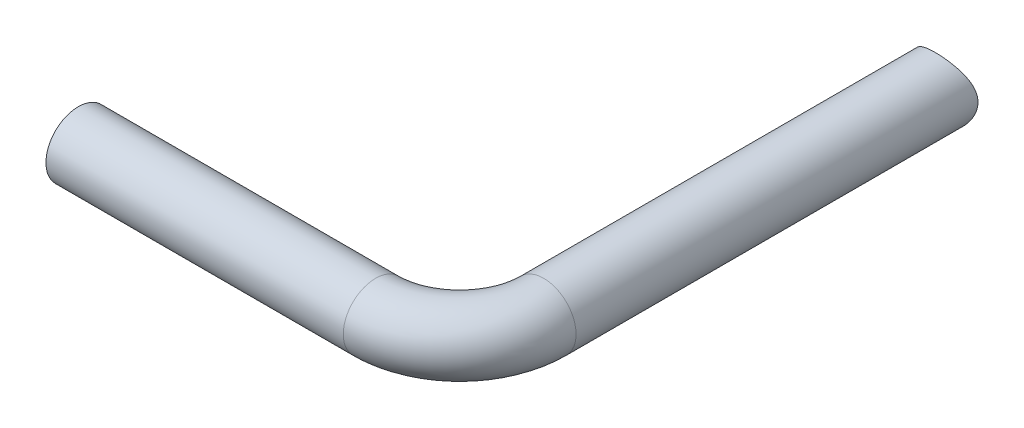
ISO-10303-21;
HEADER;
FILE_DESCRIPTION(('STEP AP214'),'2;1');
FILE_NAME('part.step','',(''),(''),'','','');
FILE_SCHEMA(('AUTOMOTIVE_DESIGN { 1 0 10303 214 1 1 1 1 }'));
ENDSEC;
DATA;
#1=APPLICATION_CONTEXT('core data for automotive mechanical design processes');
#2=APPLICATION_PROTOCOL_DEFINITION('international standard','automotive_design',2000,#1);
#3=PRODUCT_CONTEXT('',#1,'mechanical');
#4=PRODUCT('Part','Part','',(#3));
#5=PRODUCT_RELATED_PRODUCT_CATEGORY('part','',(#4));
#6=PRODUCT_DEFINITION_FORMATION('','',#4);
#7=PRODUCT_DEFINITION_CONTEXT('part definition',#1,'design');
#8=PRODUCT_DEFINITION('design','',#6,#7);
#9=PRODUCT_DEFINITION_SHAPE('','',#8);
#10=(LENGTH_UNIT() NAMED_UNIT(*) SI_UNIT(.MILLI.,.METRE.));
#11=(NAMED_UNIT(*) PLANE_ANGLE_UNIT() SI_UNIT($,.RADIAN.));
#12=(NAMED_UNIT(*) SI_UNIT($,.STERADIAN.) SOLID_ANGLE_UNIT());
#13=UNCERTAINTY_MEASURE_WITH_UNIT(LENGTH_MEASURE(1.E-05),#10,'distance_accuracy_value','');
#14=(GEOMETRIC_REPRESENTATION_CONTEXT(3) GLOBAL_UNCERTAINTY_ASSIGNED_CONTEXT((#13)) GLOBAL_UNIT_ASSIGNED_CONTEXT((#10,
#11,#12)) REPRESENTATION_CONTEXT('',''));
#15=CARTESIAN_POINT('',(0.,0.,0.));
#16=DIRECTION('',(0.,0.,1.));
#17=DIRECTION('',(1.,0.,0.));
#18=AXIS2_PLACEMENT_3D('',#15,#16,#17);
#19=CARTESIAN_POINT('',(22.14,-0.535,-3.8));
#20=DIRECTION('',(-1.,0.,0.));
#21=DIRECTION('',(0.,0.,1.));
#22=AXIS2_PLACEMENT_3D('',#19,#20,#21);
#23=PLANE('',#22);
#24=CARTESIAN_POINT('',(22.14,-0.535,-3.8));
#25=DIRECTION('',(1.,0.,0.));
#26=DIRECTION('',(0.,0.,-1.));
#27=AXIS2_PLACEMENT_3D('',#24,#25,#26);
#28=CIRCLE('',#27,0.435);
#29=CARTESIAN_POINT('',(22.14,-0.535,-4.235));
#30=VERTEX_POINT('',#29);
#31=EDGE_CURVE('E17',#30,#30,#28,.T.);
#32=ORIENTED_EDGE('',*,*,#31,.F.);
#33=EDGE_LOOP('',(#32));
#34=FACE_BOUND('',#33,.T.);
#35=ADVANCED_FACE('F14',(#34),#23,.T.);
#36=CARTESIAN_POINT('',(24.14,-0.535,-3.8));
#37=DIRECTION('',(1.,0.,0.));
#38=DIRECTION('',(0.,0.,-1.));
#39=AXIS2_PLACEMENT_3D('',#36,#37,#38);
#40=CYLINDRICAL_SURFACE('',#39,0.435);
#41=CARTESIAN_POINT('',(26.14,-0.535,-3.8));
#42=DIRECTION('',(-1.,0.,0.));
#43=DIRECTION('',(0.,0.,1.));
#44=AXIS2_PLACEMENT_3D('',#41,#42,#43);
#45=CIRCLE('',#44,0.435);
#46=CARTESIAN_POINT('',(26.14,-0.535,-3.365));
#47=VERTEX_POINT('',#46);
#48=EDGE_CURVE('E25',#47,#47,#45,.F.);
#49=ORIENTED_EDGE('',*,*,#48,.F.);
#50=EDGE_LOOP('',(#49));
#51=FACE_BOUND('',#50,.T.);
#52=ORIENTED_EDGE('',*,*,#31,.T.);
#53=EDGE_LOOP('',(#52));
#54=FACE_BOUND('',#53,.T.);
#55=ADVANCED_FACE('F50',(#51,#54),#40,.T.);
#56=CARTESIAN_POINT('',(26.14,-0.535,-4.931));
#57=DIRECTION('',(0.,-1.,0.));
#58=DIRECTION('',(0.,0.,-1.));
#59=AXIS2_PLACEMENT_3D('',#56,#57,#58);
#60=TOROIDAL_SURFACE('',#59,1.131,0.435);
#61=CARTESIAN_POINT('',(27.271,-0.535,-4.931));
#62=DIRECTION('',(0.,0.,1.));
#63=DIRECTION('',(1.,0.,0.));
#64=AXIS2_PLACEMENT_3D('',#61,#62,#63);
#65=CIRCLE('',#64,0.435);
#66=CARTESIAN_POINT('',(27.706,-0.535,-4.931));
#67=VERTEX_POINT('',#66);
#68=EDGE_CURVE('E21',#67,#67,#65,.F.);
#69=ORIENTED_EDGE('',*,*,#68,.F.);
#70=EDGE_LOOP('',(#69));
#71=FACE_BOUND('',#70,.T.);
#72=ORIENTED_EDGE('',*,*,#48,.T.);
#73=EDGE_LOOP('',(#72));
#74=FACE_BOUND('',#73,.T.);
#75=ADVANCED_FACE('F44',(#71,#74),#60,.T.);
#76=CARTESIAN_POINT('',(27.271,-3.665,-10.931));
#77=DIRECTION('',(0.,1.,0.));
#78=DIRECTION('',(0.,0.,1.));
#79=AXIS2_PLACEMENT_3D('',#76,#77,#78);
#80=CYLINDRICAL_SURFACE('',#79,0.735);
#81=CARTESIAN_POINT('',(26.836,-0.535,-10.3385474702561));
#82=CARTESIAN_POINT('',(26.8360005647153,-0.556954222551313,-10.3385465609904));
#83=CARTESIAN_POINT('',(26.8376731187665,-0.57891237806569,-10.3373079731628));
#84=CARTESIAN_POINT('',(26.8442473344186,-0.622095927561948,-10.3325665423553));
#85=CARTESIAN_POINT('',(26.8491528936226,-0.643320404500126,-10.3290609664663));
#86=CARTESIAN_POINT('',(26.8618706323377,-0.684319099069375,-10.3203475470956));
#87=CARTESIAN_POINT('',(26.8696622256891,-0.704102428301185,-10.3151517909337));
#88=CARTESIAN_POINT('',(26.887866653483,-0.742069156262738,-10.3036647702962));
#89=CARTESIAN_POINT('',(26.8982802912099,-0.760252062381975,-10.2973731702824));
#90=CARTESIAN_POINT('',(26.9228737740754,-0.796869316262689,-10.2835009331679));
#91=CARTESIAN_POINT('',(26.9373538220227,-0.815077698580844,-10.2758559149844));
#92=CARTESIAN_POINT('',(26.9690529422247,-0.848994047177061,-10.260655028147));
#93=CARTESIAN_POINT('',(26.9862739574127,-0.86470022384603,-10.2530992268465));
#94=CARTESIAN_POINT('',(27.0251423062467,-0.894782702271872,-10.2379941279284));
#95=CARTESIAN_POINT('',(27.0470638057929,-0.908850320798863,-10.2305274013139));
#96=CARTESIAN_POINT('',(27.0934883724852,-0.932991404871281,-10.2173510870467));
#97=CARTESIAN_POINT('',(27.1179891260755,-0.943068411944317,-10.2116399423887));
#98=CARTESIAN_POINT('',(27.166457615788,-0.957938508714837,-10.2030963941087));
#99=CARTESIAN_POINT('',(27.1902612636779,-0.963137325194406,-10.2000448756511));
#100=CARTESIAN_POINT('',(27.238578853247,-0.96947199738723,-10.1963170911829));
#101=CARTESIAN_POINT('',(27.2630921299149,-0.970611540345753,-10.1956386695775));
#102=CARTESIAN_POINT('',(27.3089424451452,-0.968874705511524,-10.1966653804129));
#103=CARTESIAN_POINT('',(27.330305614158,-0.966466611709409,-10.1980926042753));
#104=CARTESIAN_POINT('',(27.3722600772495,-0.958588157734641,-10.202702872477));
#105=CARTESIAN_POINT('',(27.3928513144541,-0.953117572395495,-10.2058860459205));
#106=CARTESIAN_POINT('',(27.4328934493032,-0.939311108558711,-10.2137586111302));
#107=CARTESIAN_POINT('',(27.4523357131124,-0.930956141823126,-10.2184580231398));
#108=CARTESIAN_POINT('',(27.4895687601387,-0.911686345049646,-10.228983242623));
#109=CARTESIAN_POINT('',(27.5073590939225,-0.900770821204063,-10.2348093553118));
#110=CARTESIAN_POINT('',(27.5430268064253,-0.875238915003947,-10.2478980007142));
#111=CARTESIAN_POINT('',(27.5606680381584,-0.860338174760663,-10.255248888245));
#112=CARTESIAN_POINT('',(27.593348973388,-0.827994405222913,-10.2702126047618));
#113=CARTESIAN_POINT('',(27.6083851875874,-0.810548022876114,-10.2778257689492));
#114=CARTESIAN_POINT('',(27.6371153084418,-0.771305143727715,-10.293441911392));
#115=CARTESIAN_POINT('',(27.6504740256555,-0.749240646850454,-10.3013940981156));
#116=CARTESIAN_POINT('',(27.6732148965372,-0.702678767480242,-10.3156711951499));
#117=CARTESIAN_POINT('',(27.6826045443437,-0.678186078720378,-10.3219991632461));
#118=CARTESIAN_POINT('',(27.6950746754993,-0.633857509451484,-10.3306435647912));
#119=CARTESIAN_POINT('',(27.6991522904458,-0.614420928648871,-10.3335708727857));
#120=CARTESIAN_POINT('',(27.704613898916,-0.574990278248642,-10.3375223133783));
#121=CARTESIAN_POINT('',(27.7060005143649,-0.55499677057322,-10.338548298451));
#122=CARTESIAN_POINT('',(27.7059994352847,-0.513045777448687,-10.3385465609904));
#123=CARTESIAN_POINT('',(27.7043268812335,-0.49108762193431,-10.3373079731628));
#124=CARTESIAN_POINT('',(27.6977526655814,-0.447904072438052,-10.3325665423553));
#125=CARTESIAN_POINT('',(27.6928471063774,-0.426679595499874,-10.3290609664663));
#126=CARTESIAN_POINT('',(27.6801293676623,-0.385680900930625,-10.3203475470956));
#127=CARTESIAN_POINT('',(27.6723377743109,-0.365897571698814,-10.3151517909337));
#128=CARTESIAN_POINT('',(27.654133346517,-0.327930843737262,-10.3036647702962));
#129=CARTESIAN_POINT('',(27.6437197087901,-0.309747937618024,-10.2973731702824));
#130=CARTESIAN_POINT('',(27.6191262259246,-0.27313068373731,-10.2835009331679));
#131=CARTESIAN_POINT('',(27.6046461779773,-0.254922301419155,-10.2758559149844));
#132=CARTESIAN_POINT('',(27.5729470577753,-0.221005952822938,-10.260655028147));
#133=CARTESIAN_POINT('',(27.5557260425873,-0.20529977615397,-10.2530992268465));
#134=CARTESIAN_POINT('',(27.5168576937533,-0.175217297728128,-10.2379941279284));
#135=CARTESIAN_POINT('',(27.4949361942071,-0.161149679201137,-10.2305274013139));
#136=CARTESIAN_POINT('',(27.4485116275148,-0.137008595128719,-10.2173510870467));
#137=CARTESIAN_POINT('',(27.4240108739245,-0.126931588055683,-10.2116399423887));
#138=CARTESIAN_POINT('',(27.375542384212,-0.112061491285164,-10.2030963941087));
#139=CARTESIAN_POINT('',(27.3517387363221,-0.106862674805594,-10.2000448756511));
#140=CARTESIAN_POINT('',(27.303421146753,-0.10052800261277,-10.1963170911829));
#141=CARTESIAN_POINT('',(27.2789078700851,-0.0993884596542465,-10.1956386695775));
#142=CARTESIAN_POINT('',(27.2330575548548,-0.101125294488476,-10.1966653804129));
#143=CARTESIAN_POINT('',(27.211694385842,-0.103533388290592,-10.1980926042753));
#144=CARTESIAN_POINT('',(27.1697399227504,-0.111411842265359,-10.202702872477));
#145=CARTESIAN_POINT('',(27.1491486855459,-0.116882427604506,-10.2058860459205));
#146=CARTESIAN_POINT('',(27.1091065506968,-0.13068889144129,-10.2137586111302));
#147=CARTESIAN_POINT('',(27.0896642868876,-0.139043858176875,-10.2184580231398));
#148=CARTESIAN_POINT('',(27.0524312398613,-0.158313654950356,-10.228983242623));
#149=CARTESIAN_POINT('',(27.0346409060775,-0.169229178795938,-10.2348093553118));
#150=CARTESIAN_POINT('',(26.9989731935747,-0.194761084996053,-10.2478980007142));
#151=CARTESIAN_POINT('',(26.9813319618416,-0.209661825239337,-10.255248888245));
#152=CARTESIAN_POINT('',(26.948651026612,-0.242005594777087,-10.2702126047618));
#153=CARTESIAN_POINT('',(26.9336148124126,-0.259451977123886,-10.2778257689492));
#154=CARTESIAN_POINT('',(26.9048846915582,-0.298694856272285,-10.293441911392));
#155=CARTESIAN_POINT('',(26.8915259743445,-0.320759353149546,-10.3013940981156));
#156=CARTESIAN_POINT('',(26.8687851034628,-0.367321232519759,-10.3156711951499));
#157=CARTESIAN_POINT('',(26.8593954556563,-0.391813921279623,-10.3219991632461));
#158=CARTESIAN_POINT('',(26.8469253245007,-0.436142490548516,-10.3306435647912));
#159=CARTESIAN_POINT('',(26.8428477095542,-0.45557907135113,-10.3335708727857));
#160=CARTESIAN_POINT('',(26.837386101084,-0.495009721751358,-10.3375223133783));
#161=CARTESIAN_POINT('',(26.8359994856351,-0.51500322942678,-10.338548298451));
#162=CARTESIAN_POINT('',(26.836,-0.535,-10.3385474702561));
#163=B_SPLINE_CURVE_WITH_KNOTS('',3,(#81,#82,#83,#84,#85,#86,#87,#88,#89,#90,#91,#92,#93,#94,
#95,#96,#97,#98,#99,#100,#101,#102,#103,#104,#105,#106,#107,#108,#109,#110,#111,#112,#113,#114,
#115,#116,#117,#118,#119,#120,#121,#122,#123,#124,#125,#126,#127,#128,#129,#130,#131,#132,#133,
#134,#135,#136,#137,#138,#139,#140,#141,#142,#143,#144,#145,#146,#147,#148,#149,#150,#151,#152,
#153,#154,#155,#156,#157,#158,#159,#160,#161,#162),.UNSPECIFIED.,.T.,.F.,(4,2,2,2,2,2,2,2,2,2,2,
2,2,2,2,2,2,2,2,2,2,2,2,2,2,2,2,2,2,2,2,2,2,2,2,2,2,2,2,2,4),(0.,0.0657776139138671,
0.13163467253878,0.197030744034767,0.26244687457087,0.33562178325059,0.408848794847427,
0.489699349619978,0.5704779906967,0.643709145150274,0.716873763023103,0.781204208282166,
0.845539383991416,0.910308747525187,0.975095681256825,1.04750704995348,1.1200146727007,
1.20058507251315,1.28100265756803,1.34097396030624,1.40088680172958,1.46666441564345,
1.53252147426836,1.59791754576435,1.66333367630045,1.73650858498017,1.80973559657701,
1.89058615134956,1.97136479242628,2.04459594687985,2.11776056475269,2.18209101001175,
2.246426185721,2.31119554925478,2.37598248298641,2.44839385168306,2.52090147443028,
2.60147187424273,2.68188945929761,2.74186076203583,2.80177360345916),.UNSPECIFIED.);
#164=CARTESIAN_POINT('',(26.836,-0.535,-10.3385474702561));
#165=VERTEX_POINT('',#164);
#166=EDGE_CURVE('E10',#165,#165,#163,.T.);
#167=ORIENTED_EDGE('',*,*,#166,.F.);
#168=EDGE_LOOP('',(#167));
#169=FACE_BOUND('',#168,.T.);
#170=ADVANCED_FACE('F33',(#169),#80,.F.);
#171=CARTESIAN_POINT('',(27.271,-0.535,-6.931));
#172=DIRECTION('',(0.,0.,1.));
#173=DIRECTION('',(1.,0.,0.));
#174=AXIS2_PLACEMENT_3D('',#171,#172,#173);
#175=CYLINDRICAL_SURFACE('',#174,0.435);
#176=ORIENTED_EDGE('',*,*,#68,.T.);
#177=EDGE_LOOP('',(#176));
#178=FACE_BOUND('',#177,.T.);
#179=ORIENTED_EDGE('',*,*,#166,.T.);
#180=EDGE_LOOP('',(#179));
#181=FACE_BOUND('',#180,.T.);
#182=ADVANCED_FACE('F36',(#178,#181),#175,.T.);
#183=CLOSED_SHELL('',(#35,#55,#75,#170,#182));
#184=MANIFOLD_SOLID_BREP('B1',#183);
#185=ADVANCED_BREP_SHAPE_REPRESENTATION('',(#18,#184),#14);
#186=SHAPE_DEFINITION_REPRESENTATION(#9,#185);
ENDSEC;
END-ISO-10303-21;
